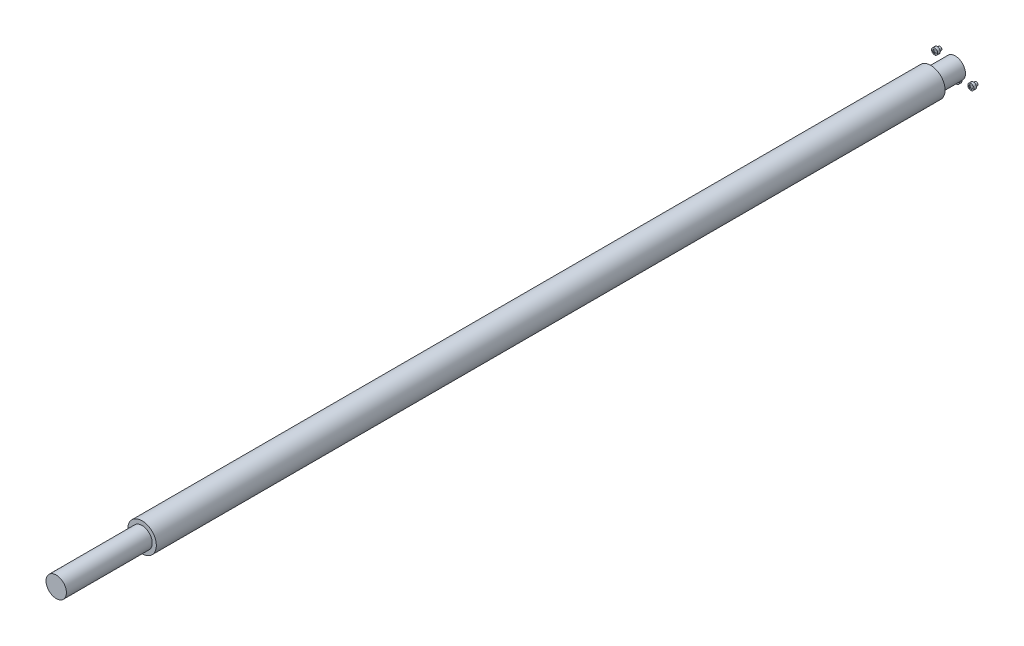
ISO-10303-21;
HEADER;
FILE_DESCRIPTION(('STEP AP214'),'2;1');
FILE_NAME('part.step','',(''),(''),'','','');
FILE_SCHEMA(('AUTOMOTIVE_DESIGN { 1 0 10303 214 1 1 1 1 }'));
ENDSEC;
DATA;
#1=APPLICATION_CONTEXT('core data for automotive mechanical design processes');
#2=APPLICATION_PROTOCOL_DEFINITION('international standard','automotive_design',2000,#1);
#3=PRODUCT_CONTEXT('',#1,'mechanical');
#4=PRODUCT('Part','Part','',(#3));
#5=PRODUCT_RELATED_PRODUCT_CATEGORY('part','',(#4));
#6=PRODUCT_DEFINITION_FORMATION('','',#4);
#7=PRODUCT_DEFINITION_CONTEXT('part definition',#1,'design');
#8=PRODUCT_DEFINITION('design','',#6,#7);
#9=PRODUCT_DEFINITION_SHAPE('','',#8);
#10=(LENGTH_UNIT() NAMED_UNIT(*) SI_UNIT(.MILLI.,.METRE.));
#11=(NAMED_UNIT(*) PLANE_ANGLE_UNIT() SI_UNIT($,.RADIAN.));
#12=(NAMED_UNIT(*) SI_UNIT($,.STERADIAN.) SOLID_ANGLE_UNIT());
#13=UNCERTAINTY_MEASURE_WITH_UNIT(LENGTH_MEASURE(1.E-05),#10,'distance_accuracy_value','');
#14=(GEOMETRIC_REPRESENTATION_CONTEXT(3) GLOBAL_UNCERTAINTY_ASSIGNED_CONTEXT((#13)) GLOBAL_UNIT_ASSIGNED_CONTEXT((#10,
#11,#12)) REPRESENTATION_CONTEXT('',''));
#15=CARTESIAN_POINT('',(0.,0.,0.));
#16=DIRECTION('',(0.,0.,1.));
#17=DIRECTION('',(1.,0.,0.));
#18=AXIS2_PLACEMENT_3D('',#15,#16,#17);
#19=CARTESIAN_POINT('',(582.682782954776,1105.19471758166,970.659545106125));
#20=DIRECTION('',(0.,0.,1.));
#21=DIRECTION('',(0.944379552147023,-0.328857509396682,0.));
#22=AXIS2_PLACEMENT_3D('',#19,#20,#21);
#23=PLANE('',#22);
#24=CARTESIAN_POINT('',(582.682782954776,1105.19471758166,970.659545106125));
#25=DIRECTION('',(0.,0.,1.));
#26=DIRECTION('',(0.944379552147023,-0.328857509396682,0.));
#27=AXIS2_PLACEMENT_3D('',#24,#25,#26);
#28=CIRCLE('',#27,0.825);
#29=CARTESIAN_POINT('',(583.461896085297,1104.92341013641,970.659545106125));
#30=VERTEX_POINT('',#29);
#31=EDGE_CURVE('P0_E25',#30,#30,#28,.T.);
#32=ORIENTED_EDGE('',*,*,#31,.T.);
#33=EDGE_LOOP('',(#32));
#34=FACE_BOUND('',#33,.T.);
#35=ADVANCED_FACE('P0_F17',(#34),#23,.T.);
#36=CARTESIAN_POINT('',(582.682782954776,1105.19471758166,970.659545106125));
#37=DIRECTION('',(0.,0.,1.));
#38=DIRECTION('',(0.944379552147023,-0.328857509396682,0.));
#39=AXIS2_PLACEMENT_3D('',#36,#37,#38);
#40=CYLINDRICAL_SURFACE('',#39,0.875);
#41=CARTESIAN_POINT('',(582.682782954776,1105.19471758166,970.609545106125));
#42=DIRECTION('',(0.,0.,1.));
#43=DIRECTION('',(0.944379552147023,-0.328857509396682,0.));
#44=AXIS2_PLACEMENT_3D('',#41,#42,#43);
#45=CIRCLE('',#44,0.875);
#46=CARTESIAN_POINT('',(583.509115062905,1104.90696726094,970.609545106125));
#47=VERTEX_POINT('',#46);
#48=EDGE_CURVE('P0_E11',#47,#47,#45,.F.);
#49=ORIENTED_EDGE('',*,*,#48,.T.);
#50=EDGE_LOOP('',(#49));
#51=FACE_BOUND('',#50,.T.);
#52=CARTESIAN_POINT('',(582.682782954776,1105.19471758166,969.219545106125));
#53=DIRECTION('',(0.,0.,1.));
#54=DIRECTION('',(0.944379552147023,-0.328857509396682,0.));
#55=AXIS2_PLACEMENT_3D('',#52,#53,#54);
#56=CIRCLE('',#55,0.875);
#57=CARTESIAN_POINT('',(583.509115062905,1104.90696726094,969.219545106125));
#58=VERTEX_POINT('',#57);
#59=EDGE_CURVE('P0_E130',#58,#58,#56,.T.);
#60=ORIENTED_EDGE('',*,*,#59,.T.);
#61=EDGE_LOOP('',(#60));
#62=FACE_BOUND('',#61,.T.);
#63=ADVANCED_FACE('P0_F146',(#51,#62),#40,.T.);
#64=CARTESIAN_POINT('',(582.970533275498,1106.02104968979,969.219545106125));
#65=DIRECTION('',(0.,0.,1.));
#66=DIRECTION('',(0.944379552147023,-0.328857509396682,0.));
#67=AXIS2_PLACEMENT_3D('',#64,#65,#66);
#68=PLANE('',#67);
#69=CARTESIAN_POINT('',(582.682782954776,1105.19471758166,969.219545106125));
#70=DIRECTION('',(0.,0.,1.));
#71=DIRECTION('',(0.944379552147023,-0.328857509396682,0.));
#72=AXIS2_PLACEMENT_3D('',#69,#70,#71);
#73=CIRCLE('',#72,1.5);
#74=CARTESIAN_POINT('',(584.099352282997,1104.70143131756,969.219545106125));
#75=VERTEX_POINT('',#74);
#76=EDGE_CURVE('P0_E127',#75,#75,#73,.T.);
#77=ORIENTED_EDGE('',*,*,#76,.T.);
#78=EDGE_LOOP('',(#77));
#79=FACE_BOUND('',#78,.T.);
#80=ORIENTED_EDGE('',*,*,#59,.F.);
#81=EDGE_LOOP('',(#80));
#82=FACE_BOUND('',#81,.T.);
#83=ADVANCED_FACE('P0_F150',(#79,#82),#68,.T.);
#84=CARTESIAN_POINT('',(582.682782954776,1105.19471758166,970.659545106125));
#85=DIRECTION('',(0.,0.,1.));
#86=DIRECTION('',(0.944379552147023,-0.328857509396682,0.));
#87=AXIS2_PLACEMENT_3D('',#84,#85,#86);
#88=CYLINDRICAL_SURFACE('',#87,1.5);
#89=CARTESIAN_POINT('',(582.682782954776,1105.19471758166,967.969545106125));
#90=DIRECTION('',(0.,0.,1.));
#91=DIRECTION('',(0.944379552147023,-0.328857509396682,0.));
#92=AXIS2_PLACEMENT_3D('',#89,#90,#91);
#93=CIRCLE('',#92,1.5);
#94=CARTESIAN_POINT('',(584.099352282997,1104.70143131756,967.969545106125));
#95=VERTEX_POINT('',#94);
#96=EDGE_CURVE('P0_E119',#95,#95,#93,.T.);
#97=ORIENTED_EDGE('',*,*,#96,.T.);
#98=EDGE_LOOP('',(#97));
#99=FACE_BOUND('',#98,.T.);
#100=ORIENTED_EDGE('',*,*,#76,.F.);
#101=EDGE_LOOP('',(#100));
#102=FACE_BOUND('',#101,.T.);
#103=ADVANCED_FACE('P0_F156',(#99,#102),#88,.T.);
#104=CARTESIAN_POINT('',(583.176069218871,1106.61128690988,967.969545106125));
#105=DIRECTION('',(0.,0.,-1.));
#106=DIRECTION('',(-0.944379552147023,0.328857509396682,0.));
#107=AXIS2_PLACEMENT_3D('',#104,#105,#106);
#108=PLANE('',#107);
#109=DIRECTION('',(0.187390818710705,-0.982285437672234,0.));
#110=VECTOR('',#109,1.);
#111=CARTESIAN_POINT('',(583.447616340566,1105.85491696466,967.969545106125));
#112=LINE('',#111,#110);
#113=CARTESIAN_POINT('',(583.447616340566,1105.85491696466,967.969545106125));
#114=VERTEX_POINT('',#113);
#115=CARTESIAN_POINT('',(583.636949084912,1104.8624521314,967.969545106125));
#116=VERTEX_POINT('',#115);
#117=EDGE_CURVE('P0_E32',#114,#116,#112,.T.);
#118=ORIENTED_EDGE('',*,*,#117,.F.);
#119=DIRECTION('',(0.944379552147023,-0.328857509396682,0.));
#120=VECTOR('',#119,1.);
#121=CARTESIAN_POINT('',(582.49345021043,1106.18718241492,967.969545106125));
#122=LINE('',#121,#120);
#123=CARTESIAN_POINT('',(582.49345021043,1106.18718241492,967.969545106125));
#124=VERTEX_POINT('',#123);
#125=EDGE_CURVE('P0_E115',#124,#114,#122,.T.);
#126=ORIENTED_EDGE('',*,*,#125,.F.);
#127=DIRECTION('',(0.756988733436318,0.653427928275552,0.));
#128=VECTOR('',#127,1.);
#129=CARTESIAN_POINT('',(581.72861682464,1105.52698303192,967.969545106125));
#130=LINE('',#129,#128);
#131=CARTESIAN_POINT('',(581.72861682464,1105.52698303192,967.969545106125));
#132=VERTEX_POINT('',#131);
#133=EDGE_CURVE('P0_E113',#132,#124,#130,.T.);
#134=ORIENTED_EDGE('',*,*,#133,.F.);
#135=DIRECTION('',(-0.187390818710705,0.982285437672234,0.));
#136=VECTOR('',#135,1.);
#137=CARTESIAN_POINT('',(581.917949568986,1104.53451819866,967.969545106125));
#138=LINE('',#137,#136);
#139=CARTESIAN_POINT('',(581.917949568986,1104.53451819866,967.969545106125));
#140=VERTEX_POINT('',#139);
#141=EDGE_CURVE('P0_E80',#140,#132,#138,.T.);
#142=ORIENTED_EDGE('',*,*,#141,.F.);
#143=DIRECTION('',(-0.944379552147023,0.328857509396682,0.));
#144=VECTOR('',#143,1.);
#145=CARTESIAN_POINT('',(582.872115699122,1104.2022527484,967.969545106125));
#146=LINE('',#145,#144);
#147=CARTESIAN_POINT('',(582.872115699122,1104.2022527484,967.969545106125));
#148=VERTEX_POINT('',#147);
#149=EDGE_CURVE('P0_E109',#148,#140,#146,.T.);
#150=ORIENTED_EDGE('',*,*,#149,.F.);
#151=DIRECTION('',(-0.756988733436318,-0.653427928275552,0.));
#152=VECTOR('',#151,1.);
#153=CARTESIAN_POINT('',(583.636949084912,1104.8624521314,967.969545106125));
#154=LINE('',#153,#152);
#155=EDGE_CURVE('P0_E106',#116,#148,#154,.T.);
#156=ORIENTED_EDGE('',*,*,#155,.F.);
#157=EDGE_LOOP('',(#118,#126,#134,#142,#150,#156));
#158=FACE_BOUND('',#157,.T.);
#159=ORIENTED_EDGE('',*,*,#96,.F.);
#160=EDGE_LOOP('',(#159));
#161=FACE_BOUND('',#160,.T.);
#162=ADVANCED_FACE('P0_F160',(#158,#161),#108,.T.);
#163=CARTESIAN_POINT('',(583.447616340566,1105.85491696466,968.469545106125));
#164=DIRECTION('',(0.982285437672234,0.187390818710705,0.));
#165=DIRECTION('',(-0.187390818710705,0.982285437672234,0.));
#166=AXIS2_PLACEMENT_3D('',#163,#164,#165);
#167=PLANE('',#166);
#168=ORIENTED_EDGE('',*,*,#117,.T.);
#169=DIRECTION('',(0.,0.,-1.));
#170=VECTOR('',#169,1.);
#171=CARTESIAN_POINT('',(583.636949084912,1104.8624521314,968.469545106125));
#172=LINE('',#171,#170);
#173=CARTESIAN_POINT('',(583.636949084912,1104.8624521314,968.469545106125));
#174=VERTEX_POINT('',#173);
#175=EDGE_CURVE('P0_E62',#174,#116,#172,.T.);
#176=ORIENTED_EDGE('',*,*,#175,.F.);
#177=DIRECTION('',(0.187390818710705,-0.982285437672234,0.));
#178=VECTOR('',#177,1.);
#179=CARTESIAN_POINT('',(583.447616340566,1105.85491696466,968.469545106125));
#180=LINE('',#179,#178);
#181=CARTESIAN_POINT('',(583.447616340566,1105.85491696466,968.469545106125));
#182=VERTEX_POINT('',#181);
#183=EDGE_CURVE('P0_E117',#182,#174,#180,.T.);
#184=ORIENTED_EDGE('',*,*,#183,.F.);
#185=DIRECTION('',(0.,0.,-1.));
#186=VECTOR('',#185,1.);
#187=CARTESIAN_POINT('',(583.447616340566,1105.85491696466,968.469545106125));
#188=LINE('',#187,#186);
#189=EDGE_CURVE('P0_E40',#182,#114,#188,.T.);
#190=ORIENTED_EDGE('',*,*,#189,.T.);
#191=EDGE_LOOP('',(#168,#176,#184,#190));
#192=FACE_BOUND('',#191,.T.);
#193=ADVANCED_FACE('P0_F164',(#192),#167,.F.);
#194=CARTESIAN_POINT('',(582.49345021043,1106.18718241492,968.469545106125));
#195=DIRECTION('',(0.328857509396682,0.944379552147023,0.));
#196=DIRECTION('',(-0.944379552147023,0.328857509396682,0.));
#197=AXIS2_PLACEMENT_3D('',#194,#195,#196);
#198=PLANE('',#197);
#199=ORIENTED_EDGE('',*,*,#125,.T.);
#200=ORIENTED_EDGE('',*,*,#189,.F.);
#201=DIRECTION('',(0.944379552147023,-0.328857509396682,0.));
#202=VECTOR('',#201,1.);
#203=CARTESIAN_POINT('',(582.49345021043,1106.18718241492,968.469545106125));
#204=LINE('',#203,#202);
#205=CARTESIAN_POINT('',(582.49345021043,1106.18718241492,968.469545106125));
#206=VERTEX_POINT('',#205);
#207=EDGE_CURVE('P0_E92',#206,#182,#204,.T.);
#208=ORIENTED_EDGE('',*,*,#207,.F.);
#209=DIRECTION('',(0.,0.,-1.));
#210=VECTOR('',#209,1.);
#211=CARTESIAN_POINT('',(582.49345021043,1106.18718241492,968.469545106125));
#212=LINE('',#211,#210);
#213=EDGE_CURVE('P0_E84',#206,#124,#212,.T.);
#214=ORIENTED_EDGE('',*,*,#213,.T.);
#215=EDGE_LOOP('',(#199,#200,#208,#214));
#216=FACE_BOUND('',#215,.T.);
#217=ADVANCED_FACE('P0_F168',(#216),#198,.F.);
#218=CARTESIAN_POINT('',(581.72861682464,1105.52698303192,968.469545106125));
#219=DIRECTION('',(-0.653427928275552,0.756988733436318,0.));
#220=DIRECTION('',(-0.756988733436318,-0.653427928275552,0.));
#221=AXIS2_PLACEMENT_3D('',#218,#219,#220);
#222=PLANE('',#221);
#223=ORIENTED_EDGE('',*,*,#133,.T.);
#224=ORIENTED_EDGE('',*,*,#213,.F.);
#225=DIRECTION('',(0.756988733436318,0.653427928275552,0.));
#226=VECTOR('',#225,1.);
#227=CARTESIAN_POINT('',(581.72861682464,1105.52698303192,968.469545106125));
#228=LINE('',#227,#226);
#229=CARTESIAN_POINT('',(581.72861682464,1105.52698303192,968.469545106125));
#230=VERTEX_POINT('',#229);
#231=EDGE_CURVE('P0_E88',#230,#206,#228,.T.);
#232=ORIENTED_EDGE('',*,*,#231,.F.);
#233=DIRECTION('',(0.,0.,-1.));
#234=VECTOR('',#233,1.);
#235=CARTESIAN_POINT('',(581.72861682464,1105.52698303192,968.469545106125));
#236=LINE('',#235,#234);
#237=EDGE_CURVE('P0_E73',#230,#132,#236,.T.);
#238=ORIENTED_EDGE('',*,*,#237,.T.);
#239=EDGE_LOOP('',(#223,#224,#232,#238));
#240=FACE_BOUND('',#239,.T.);
#241=ADVANCED_FACE('P0_F89',(#240),#222,.F.);
#242=CARTESIAN_POINT('',(581.917949568986,1104.53451819866,968.469545106125));
#243=DIRECTION('',(-0.982285437672234,-0.187390818710705,0.));
#244=DIRECTION('',(0.187390818710705,-0.982285437672234,0.));
#245=AXIS2_PLACEMENT_3D('',#242,#243,#244);
#246=PLANE('',#245);
#247=ORIENTED_EDGE('',*,*,#141,.T.);
#248=ORIENTED_EDGE('',*,*,#237,.F.);
#249=DIRECTION('',(-0.187390818710705,0.982285437672234,0.));
#250=VECTOR('',#249,1.);
#251=CARTESIAN_POINT('',(581.917949568986,1104.53451819866,968.469545106125));
#252=LINE('',#251,#250);
#253=CARTESIAN_POINT('',(581.917949568986,1104.53451819866,968.469545106125));
#254=VERTEX_POINT('',#253);
#255=EDGE_CURVE('P0_E77',#254,#230,#252,.T.);
#256=ORIENTED_EDGE('',*,*,#255,.F.);
#257=DIRECTION('',(0.,0.,-1.));
#258=VECTOR('',#257,1.);
#259=CARTESIAN_POINT('',(581.917949568986,1104.53451819866,968.469545106125));
#260=LINE('',#259,#258);
#261=EDGE_CURVE('P0_E85',#254,#140,#260,.T.);
#262=ORIENTED_EDGE('',*,*,#261,.T.);
#263=EDGE_LOOP('',(#247,#248,#256,#262));
#264=FACE_BOUND('',#263,.T.);
#265=ADVANCED_FACE('P0_F75',(#264),#246,.F.);
#266=CARTESIAN_POINT('',(582.872115699122,1104.2022527484,968.469545106125));
#267=DIRECTION('',(-0.328857509396682,-0.944379552147023,0.));
#268=DIRECTION('',(0.944379552147023,-0.328857509396682,0.));
#269=AXIS2_PLACEMENT_3D('',#266,#267,#268);
#270=PLANE('',#269);
#271=ORIENTED_EDGE('',*,*,#149,.T.);
#272=ORIENTED_EDGE('',*,*,#261,.F.);
#273=DIRECTION('',(-0.944379552147023,0.328857509396682,0.));
#274=VECTOR('',#273,1.);
#275=CARTESIAN_POINT('',(582.872115699122,1104.2022527484,968.469545106125));
#276=LINE('',#275,#274);
#277=CARTESIAN_POINT('',(582.872115699122,1104.2022527484,968.469545106125));
#278=VERTEX_POINT('',#277);
#279=EDGE_CURVE('P0_E98',#278,#254,#276,.T.);
#280=ORIENTED_EDGE('',*,*,#279,.F.);
#281=DIRECTION('',(0.,0.,-1.));
#282=VECTOR('',#281,1.);
#283=CARTESIAN_POINT('',(582.872115699122,1104.2022527484,968.469545106125));
#284=LINE('',#283,#282);
#285=EDGE_CURVE('P0_E122',#278,#148,#284,.T.);
#286=ORIENTED_EDGE('',*,*,#285,.T.);
#287=EDGE_LOOP('',(#271,#272,#280,#286));
#288=FACE_BOUND('',#287,.T.);
#289=ADVANCED_FACE('P0_F171',(#288),#270,.F.);
#290=CARTESIAN_POINT('',(583.636949084912,1104.8624521314,968.469545106125));
#291=DIRECTION('',(0.653427928275552,-0.756988733436318,0.));
#292=DIRECTION('',(0.756988733436318,0.653427928275552,0.));
#293=AXIS2_PLACEMENT_3D('',#290,#291,#292);
#294=PLANE('',#293);
#295=ORIENTED_EDGE('',*,*,#155,.T.);
#296=ORIENTED_EDGE('',*,*,#285,.F.);
#297=DIRECTION('',(-0.756988733436318,-0.653427928275552,0.));
#298=VECTOR('',#297,1.);
#299=CARTESIAN_POINT('',(583.636949084912,1104.8624521314,968.469545106125));
#300=LINE('',#299,#298);
#301=EDGE_CURVE('P0_E100',#174,#278,#300,.T.);
#302=ORIENTED_EDGE('',*,*,#301,.F.);
#303=ORIENTED_EDGE('',*,*,#175,.T.);
#304=EDGE_LOOP('',(#295,#296,#302,#303));
#305=FACE_BOUND('',#304,.T.);
#306=ADVANCED_FACE('P0_F142',(#305),#294,.F.);
#307=CARTESIAN_POINT('',(582.682782954776,1105.19471758166,968.469545106125));
#308=DIRECTION('',(0.,0.,-1.));
#309=DIRECTION('',(-0.944379552147023,0.328857509396682,0.));
#310=AXIS2_PLACEMENT_3D('',#307,#308,#309);
#311=PLANE('',#310);
#312=ORIENTED_EDGE('',*,*,#183,.T.);
#313=ORIENTED_EDGE('',*,*,#301,.T.);
#314=ORIENTED_EDGE('',*,*,#279,.T.);
#315=ORIENTED_EDGE('',*,*,#255,.T.);
#316=ORIENTED_EDGE('',*,*,#231,.T.);
#317=ORIENTED_EDGE('',*,*,#207,.T.);
#318=EDGE_LOOP('',(#312,#313,#314,#315,#316,#317));
#319=FACE_BOUND('',#318,.T.);
#320=ADVANCED_FACE('P0_F95',(#319),#311,.T.);
#321=CARTESIAN_POINT('',(582.682782954776,1105.19471758166,970.659545106125));
#322=DIRECTION('',(0.,0.,-1.));
#323=DIRECTION('',(-0.944379552147023,0.328857509396682,0.));
#324=AXIS2_PLACEMENT_3D('',#321,#322,#323);
#325=CONICAL_SURFACE('',#324,0.825,0.785398163397441);
#326=ORIENTED_EDGE('',*,*,#48,.F.);
#327=EDGE_LOOP('',(#326));
#328=FACE_BOUND('',#327,.T.);
#329=ORIENTED_EDGE('',*,*,#31,.F.);
#330=EDGE_LOOP('',(#329));
#331=FACE_BOUND('',#330,.T.);
#332=ADVANCED_FACE('P0_F19',(#328,#331),#325,.T.);
#333=CLOSED_SHELL('',(#35,#63,#83,#103,#162,#193,#217,#241,#265,#289,#306,#320,#332));
#334=MANIFOLD_SOLID_BREP('P0_B1',#333);
#335=CARTESIAN_POINT('',(594.619380406748,1110.96523673244,971.379545106124));
#336=DIRECTION('',(0.,0.,-1.));
#337=DIRECTION('',(0.429136435825367,-0.903239679956046,0.));
#338=AXIS2_PLACEMENT_3D('',#335,#336,#337);
#339=PLANE('',#338);
#340=CARTESIAN_POINT('',(594.619380406748,1110.96523673244,971.379545106124));
#341=DIRECTION('',(0.,0.,-1.));
#342=DIRECTION('',(0.429136435825367,-0.903239679956046,0.));
#343=AXIS2_PLACEMENT_3D('',#340,#341,#342);
#344=CIRCLE('',#343,0.825);
#345=CARTESIAN_POINT('',(594.973417966304,1110.22006399648,971.379545106124));
#346=VERTEX_POINT('',#345);
#347=EDGE_CURVE('P1_E25',#346,#346,#344,.T.);
#348=ORIENTED_EDGE('',*,*,#347,.T.);
#349=EDGE_LOOP('',(#348));
#350=FACE_BOUND('',#349,.T.);
#351=ADVANCED_FACE('P1_F17',(#350),#339,.T.);
#352=CARTESIAN_POINT('',(594.619380406748,1110.96523673244,971.379545106124));
#353=DIRECTION('',(0.,0.,-1.));
#354=DIRECTION('',(0.429136435825367,-0.903239679956046,0.));
#355=AXIS2_PLACEMENT_3D('',#352,#353,#354);
#356=CYLINDRICAL_SURFACE('',#355,0.875);
#357=CARTESIAN_POINT('',(594.619380406748,1110.96523673244,971.429545106124));
#358=DIRECTION('',(0.,0.,-1.));
#359=DIRECTION('',(0.429136435825367,-0.903239679956046,0.));
#360=AXIS2_PLACEMENT_3D('',#357,#358,#359);
#361=CIRCLE('',#360,0.875);
#362=CARTESIAN_POINT('',(594.994874788096,1110.17490201248,971.429545106124));
#363=VERTEX_POINT('',#362);
#364=EDGE_CURVE('P1_E11',#363,#363,#361,.F.);
#365=ORIENTED_EDGE('',*,*,#364,.T.);
#366=EDGE_LOOP('',(#365));
#367=FACE_BOUND('',#366,.T.);
#368=CARTESIAN_POINT('',(594.619380406748,1110.96523673244,972.819545106124));
#369=DIRECTION('',(0.,0.,-1.));
#370=DIRECTION('',(0.429136435825367,-0.903239679956046,0.));
#371=AXIS2_PLACEMENT_3D('',#368,#369,#370);
#372=CIRCLE('',#371,0.875);
#373=CARTESIAN_POINT('',(594.994874788096,1110.17490201248,972.819545106124));
#374=VERTEX_POINT('',#373);
#375=EDGE_CURVE('P1_E130',#374,#374,#372,.T.);
#376=ORIENTED_EDGE('',*,*,#375,.T.);
#377=EDGE_LOOP('',(#376));
#378=FACE_BOUND('',#377,.T.);
#379=ADVANCED_FACE('P1_F146',(#367,#378),#356,.T.);
#380=CARTESIAN_POINT('',(593.829045686787,1110.5897423511,972.819545106124));
#381=DIRECTION('',(0.,0.,-1.));
#382=DIRECTION('',(0.429136435825367,-0.903239679956046,0.));
#383=AXIS2_PLACEMENT_3D('',#380,#381,#382);
#384=PLANE('',#383);
#385=CARTESIAN_POINT('',(594.619380406748,1110.96523673244,972.819545106124));
#386=DIRECTION('',(0.,0.,-1.));
#387=DIRECTION('',(0.429136435825367,-0.903239679956046,0.));
#388=AXIS2_PLACEMENT_3D('',#385,#386,#387);
#389=CIRCLE('',#388,1.5);
#390=CARTESIAN_POINT('',(595.263085060486,1109.61037721251,972.819545106124));
#391=VERTEX_POINT('',#390);
#392=EDGE_CURVE('P1_E127',#391,#391,#389,.T.);
#393=ORIENTED_EDGE('',*,*,#392,.T.);
#394=EDGE_LOOP('',(#393));
#395=FACE_BOUND('',#394,.T.);
#396=ORIENTED_EDGE('',*,*,#375,.F.);
#397=EDGE_LOOP('',(#396));
#398=FACE_BOUND('',#397,.T.);
#399=ADVANCED_FACE('P1_F150',(#395,#398),#384,.T.);
#400=CARTESIAN_POINT('',(594.619380406748,1110.96523673244,971.379545106124));
#401=DIRECTION('',(0.,0.,-1.));
#402=DIRECTION('',(0.429136435825367,-0.903239679956046,0.));
#403=AXIS2_PLACEMENT_3D('',#400,#401,#402);
#404=CYLINDRICAL_SURFACE('',#403,1.5);
#405=CARTESIAN_POINT('',(594.619380406748,1110.96523673244,974.069545106124));
#406=DIRECTION('',(0.,0.,-1.));
#407=DIRECTION('',(0.429136435825367,-0.903239679956046,0.));
#408=AXIS2_PLACEMENT_3D('',#405,#406,#407);
#409=CIRCLE('',#408,1.5);
#410=CARTESIAN_POINT('',(595.263085060486,1109.61037721251,974.069545106124));
#411=VERTEX_POINT('',#410);
#412=EDGE_CURVE('P1_E119',#411,#411,#409,.T.);
#413=ORIENTED_EDGE('',*,*,#412,.T.);
#414=EDGE_LOOP('',(#413));
#415=FACE_BOUND('',#414,.T.);
#416=ORIENTED_EDGE('',*,*,#392,.F.);
#417=EDGE_LOOP('',(#416));
#418=FACE_BOUND('',#417,.T.);
#419=ADVANCED_FACE('P1_F156',(#415,#418),#404,.T.);
#420=CARTESIAN_POINT('',(593.264520886814,1110.32153207871,974.069545106124));
#421=DIRECTION('',(0.,0.,1.));
#422=DIRECTION('',(-0.429136435825367,0.903239679956046,0.));
#423=AXIS2_PLACEMENT_3D('',#420,#421,#422);
#424=PLANE('',#423);
#425=DIRECTION('',(0.996796726460746,-0.0799767848637452,0.));
#426=VECTOR('',#425,1.);
#427=CARTESIAN_POINT('',(594.045837468937,1110.13344238778,974.069545106124));
#428=LINE('',#427,#426);
#429=CARTESIAN_POINT('',(594.045837468937,1110.13344238778,974.069545106124));
#430=VERTEX_POINT('',#429);
#431=CARTESIAN_POINT('',(595.052963971048,1110.0526368058,974.069545106124));
#432=VERTEX_POINT('',#431);
#433=EDGE_CURVE('P1_E32',#430,#432,#428,.T.);
#434=ORIENTED_EDGE('',*,*,#433,.F.);
#435=DIRECTION('',(0.429136435825367,-0.903239679956046,0.));
#436=VECTOR('',#435,1.);
#437=CARTESIAN_POINT('',(593.612253904637,1111.04604231442,974.069545106124));
#438=LINE('',#437,#436);
#439=CARTESIAN_POINT('',(593.612253904637,1111.04604231442,974.069545106124));
#440=VERTEX_POINT('',#439);
#441=EDGE_CURVE('P1_E115',#440,#430,#438,.T.);
#442=ORIENTED_EDGE('',*,*,#441,.F.);
#443=DIRECTION('',(-0.567660290635379,-0.823262895092301,0.));
#444=VECTOR('',#443,1.);
#445=CARTESIAN_POINT('',(594.185796842448,1111.87783665908,974.069545106124));
#446=LINE('',#445,#444);
#447=CARTESIAN_POINT('',(594.185796842448,1111.87783665908,974.069545106124));
#448=VERTEX_POINT('',#447);
#449=EDGE_CURVE('P1_E113',#448,#440,#446,.T.);
#450=ORIENTED_EDGE('',*,*,#449,.F.);
#451=DIRECTION('',(-0.996796726460745,0.0799767848637449,0.));
#452=VECTOR('',#451,1.);
#453=CARTESIAN_POINT('',(595.19292334456,1111.79703107711,974.069545106124));
#454=LINE('',#453,#452);
#455=CARTESIAN_POINT('',(595.19292334456,1111.79703107711,974.069545106124));
#456=VERTEX_POINT('',#455);
#457=EDGE_CURVE('P1_E80',#456,#448,#454,.T.);
#458=ORIENTED_EDGE('',*,*,#457,.F.);
#459=DIRECTION('',(-0.429136435825367,0.903239679956046,0.));
#460=VECTOR('',#459,1.);
#461=CARTESIAN_POINT('',(595.62650690886,1110.88443115047,974.069545106124));
#462=LINE('',#461,#460);
#463=CARTESIAN_POINT('',(595.62650690886,1110.88443115047,974.069545106124));
#464=VERTEX_POINT('',#463);
#465=EDGE_CURVE('P1_E109',#464,#456,#462,.T.);
#466=ORIENTED_EDGE('',*,*,#465,.F.);
#467=DIRECTION('',(0.567660290635379,0.823262895092301,0.));
#468=VECTOR('',#467,1.);
#469=CARTESIAN_POINT('',(595.052963971048,1110.0526368058,974.069545106124));
#470=LINE('',#469,#468);
#471=EDGE_CURVE('P1_E106',#432,#464,#470,.T.);
#472=ORIENTED_EDGE('',*,*,#471,.F.);
#473=EDGE_LOOP('',(#434,#442,#450,#458,#466,#472));
#474=FACE_BOUND('',#473,.T.);
#475=ORIENTED_EDGE('',*,*,#412,.F.);
#476=EDGE_LOOP('',(#475));
#477=FACE_BOUND('',#476,.T.);
#478=ADVANCED_FACE('P1_F160',(#474,#477),#424,.T.);
#479=CARTESIAN_POINT('',(594.045837468937,1110.13344238778,973.569545106124));
#480=DIRECTION('',(-0.0799767848637451,-0.996796726460745,0.));
#481=DIRECTION('',(-0.996796726460746,0.0799767848637452,0.));
#482=AXIS2_PLACEMENT_3D('',#479,#480,#481);
#483=PLANE('',#482);
#484=ORIENTED_EDGE('',*,*,#433,.T.);
#485=DIRECTION('',(0.,0.,1.));
#486=VECTOR('',#485,1.);
#487=CARTESIAN_POINT('',(595.052963971048,1110.0526368058,973.569545106124));
#488=LINE('',#487,#486);
#489=CARTESIAN_POINT('',(595.052963971048,1110.0526368058,973.569545106124));
#490=VERTEX_POINT('',#489);
#491=EDGE_CURVE('P1_E62',#490,#432,#488,.T.);
#492=ORIENTED_EDGE('',*,*,#491,.F.);
#493=DIRECTION('',(0.996796726460746,-0.0799767848637452,0.));
#494=VECTOR('',#493,1.);
#495=CARTESIAN_POINT('',(594.045837468937,1110.13344238778,973.569545106124));
#496=LINE('',#495,#494);
#497=CARTESIAN_POINT('',(594.045837468937,1110.13344238778,973.569545106124));
#498=VERTEX_POINT('',#497);
#499=EDGE_CURVE('P1_E117',#498,#490,#496,.T.);
#500=ORIENTED_EDGE('',*,*,#499,.F.);
#501=DIRECTION('',(0.,0.,1.));
#502=VECTOR('',#501,1.);
#503=CARTESIAN_POINT('',(594.045837468937,1110.13344238778,973.569545106124));
#504=LINE('',#503,#502);
#505=EDGE_CURVE('P1_E40',#498,#430,#504,.T.);
#506=ORIENTED_EDGE('',*,*,#505,.T.);
#507=EDGE_LOOP('',(#484,#492,#500,#506));
#508=FACE_BOUND('',#507,.T.);
#509=ADVANCED_FACE('P1_F164',(#508),#483,.F.);
#510=CARTESIAN_POINT('',(593.612253904637,1111.04604231442,973.569545106124));
#511=DIRECTION('',(-0.903239679956046,-0.429136435825367,0.));
#512=DIRECTION('',(-0.429136435825367,0.903239679956046,0.));
#513=AXIS2_PLACEMENT_3D('',#510,#511,#512);
#514=PLANE('',#513);
#515=ORIENTED_EDGE('',*,*,#441,.T.);
#516=ORIENTED_EDGE('',*,*,#505,.F.);
#517=DIRECTION('',(0.429136435825367,-0.903239679956046,0.));
#518=VECTOR('',#517,1.);
#519=CARTESIAN_POINT('',(593.612253904637,1111.04604231442,973.569545106124));
#520=LINE('',#519,#518);
#521=CARTESIAN_POINT('',(593.612253904637,1111.04604231442,973.569545106124));
#522=VERTEX_POINT('',#521);
#523=EDGE_CURVE('P1_E92',#522,#498,#520,.T.);
#524=ORIENTED_EDGE('',*,*,#523,.F.);
#525=DIRECTION('',(0.,0.,1.));
#526=VECTOR('',#525,1.);
#527=CARTESIAN_POINT('',(593.612253904637,1111.04604231442,973.569545106124));
#528=LINE('',#527,#526);
#529=EDGE_CURVE('P1_E84',#522,#440,#528,.T.);
#530=ORIENTED_EDGE('',*,*,#529,.T.);
#531=EDGE_LOOP('',(#515,#516,#524,#530));
#532=FACE_BOUND('',#531,.T.);
#533=ADVANCED_FACE('P1_F168',(#532),#514,.F.);
#534=CARTESIAN_POINT('',(594.185796842448,1111.87783665908,973.569545106124));
#535=DIRECTION('',(-0.823262895092301,0.567660290635379,0.));
#536=DIRECTION('',(0.567660290635379,0.823262895092301,0.));
#537=AXIS2_PLACEMENT_3D('',#534,#535,#536);
#538=PLANE('',#537);
#539=ORIENTED_EDGE('',*,*,#449,.T.);
#540=ORIENTED_EDGE('',*,*,#529,.F.);
#541=DIRECTION('',(-0.567660290635379,-0.823262895092301,0.));
#542=VECTOR('',#541,1.);
#543=CARTESIAN_POINT('',(594.185796842448,1111.87783665908,973.569545106124));
#544=LINE('',#543,#542);
#545=CARTESIAN_POINT('',(594.185796842448,1111.87783665908,973.569545106124));
#546=VERTEX_POINT('',#545);
#547=EDGE_CURVE('P1_E88',#546,#522,#544,.T.);
#548=ORIENTED_EDGE('',*,*,#547,.F.);
#549=DIRECTION('',(0.,0.,1.));
#550=VECTOR('',#549,1.);
#551=CARTESIAN_POINT('',(594.185796842448,1111.87783665908,973.569545106124));
#552=LINE('',#551,#550);
#553=EDGE_CURVE('P1_E73',#546,#448,#552,.T.);
#554=ORIENTED_EDGE('',*,*,#553,.T.);
#555=EDGE_LOOP('',(#539,#540,#548,#554));
#556=FACE_BOUND('',#555,.T.);
#557=ADVANCED_FACE('P1_F89',(#556),#538,.F.);
#558=CARTESIAN_POINT('',(595.19292334456,1111.79703107711,973.569545106124));
#559=DIRECTION('',(0.0799767848637448,0.996796726460745,0.));
#560=DIRECTION('',(0.996796726460745,-0.0799767848637448,0.));
#561=AXIS2_PLACEMENT_3D('',#558,#559,#560);
#562=PLANE('',#561);
#563=ORIENTED_EDGE('',*,*,#457,.T.);
#564=ORIENTED_EDGE('',*,*,#553,.F.);
#565=DIRECTION('',(-0.996796726460745,0.0799767848637449,0.));
#566=VECTOR('',#565,1.);
#567=CARTESIAN_POINT('',(595.19292334456,1111.79703107711,973.569545106124));
#568=LINE('',#567,#566);
#569=CARTESIAN_POINT('',(595.19292334456,1111.79703107711,973.569545106124));
#570=VERTEX_POINT('',#569);
#571=EDGE_CURVE('P1_E77',#570,#546,#568,.T.);
#572=ORIENTED_EDGE('',*,*,#571,.F.);
#573=DIRECTION('',(0.,0.,1.));
#574=VECTOR('',#573,1.);
#575=CARTESIAN_POINT('',(595.19292334456,1111.79703107711,973.569545106124));
#576=LINE('',#575,#574);
#577=EDGE_CURVE('P1_E85',#570,#456,#576,.T.);
#578=ORIENTED_EDGE('',*,*,#577,.T.);
#579=EDGE_LOOP('',(#563,#564,#572,#578));
#580=FACE_BOUND('',#579,.T.);
#581=ADVANCED_FACE('P1_F75',(#580),#562,.F.);
#582=CARTESIAN_POINT('',(595.62650690886,1110.88443115047,973.569545106124));
#583=DIRECTION('',(0.903239679956046,0.429136435825367,0.));
#584=DIRECTION('',(0.429136435825367,-0.903239679956046,0.));
#585=AXIS2_PLACEMENT_3D('',#582,#583,#584);
#586=PLANE('',#585);
#587=ORIENTED_EDGE('',*,*,#465,.T.);
#588=ORIENTED_EDGE('',*,*,#577,.F.);
#589=DIRECTION('',(-0.429136435825367,0.903239679956046,0.));
#590=VECTOR('',#589,1.);
#591=CARTESIAN_POINT('',(595.62650690886,1110.88443115047,973.569545106124));
#592=LINE('',#591,#590);
#593=CARTESIAN_POINT('',(595.62650690886,1110.88443115047,973.569545106124));
#594=VERTEX_POINT('',#593);
#595=EDGE_CURVE('P1_E98',#594,#570,#592,.T.);
#596=ORIENTED_EDGE('',*,*,#595,.F.);
#597=DIRECTION('',(0.,0.,1.));
#598=VECTOR('',#597,1.);
#599=CARTESIAN_POINT('',(595.62650690886,1110.88443115047,973.569545106124));
#600=LINE('',#599,#598);
#601=EDGE_CURVE('P1_E122',#594,#464,#600,.T.);
#602=ORIENTED_EDGE('',*,*,#601,.T.);
#603=EDGE_LOOP('',(#587,#588,#596,#602));
#604=FACE_BOUND('',#603,.T.);
#605=ADVANCED_FACE('P1_F171',(#604),#586,.F.);
#606=CARTESIAN_POINT('',(595.052963971048,1110.0526368058,973.569545106124));
#607=DIRECTION('',(0.823262895092301,-0.567660290635379,0.));
#608=DIRECTION('',(-0.567660290635379,-0.823262895092301,0.));
#609=AXIS2_PLACEMENT_3D('',#606,#607,#608);
#610=PLANE('',#609);
#611=ORIENTED_EDGE('',*,*,#471,.T.);
#612=ORIENTED_EDGE('',*,*,#601,.F.);
#613=DIRECTION('',(0.567660290635379,0.823262895092301,0.));
#614=VECTOR('',#613,1.);
#615=CARTESIAN_POINT('',(595.052963971048,1110.0526368058,973.569545106124));
#616=LINE('',#615,#614);
#617=EDGE_CURVE('P1_E100',#490,#594,#616,.T.);
#618=ORIENTED_EDGE('',*,*,#617,.F.);
#619=ORIENTED_EDGE('',*,*,#491,.T.);
#620=EDGE_LOOP('',(#611,#612,#618,#619));
#621=FACE_BOUND('',#620,.T.);
#622=ADVANCED_FACE('P1_F142',(#621),#610,.F.);
#623=CARTESIAN_POINT('',(594.619380406748,1110.96523673244,973.569545106124));
#624=DIRECTION('',(0.,0.,1.));
#625=DIRECTION('',(-0.429136435825367,0.903239679956046,0.));
#626=AXIS2_PLACEMENT_3D('',#623,#624,#625);
#627=PLANE('',#626);
#628=ORIENTED_EDGE('',*,*,#499,.T.);
#629=ORIENTED_EDGE('',*,*,#617,.T.);
#630=ORIENTED_EDGE('',*,*,#595,.T.);
#631=ORIENTED_EDGE('',*,*,#571,.T.);
#632=ORIENTED_EDGE('',*,*,#547,.T.);
#633=ORIENTED_EDGE('',*,*,#523,.T.);
#634=EDGE_LOOP('',(#628,#629,#630,#631,#632,#633));
#635=FACE_BOUND('',#634,.T.);
#636=ADVANCED_FACE('P1_F95',(#635),#627,.T.);
#637=CARTESIAN_POINT('',(594.619380406748,1110.96523673244,971.379545106124));
#638=DIRECTION('',(0.,0.,1.));
#639=DIRECTION('',(-0.429136435825367,0.903239679956046,0.));
#640=AXIS2_PLACEMENT_3D('',#637,#638,#639);
#641=CONICAL_SURFACE('',#640,0.825,0.785398163397441);
#642=ORIENTED_EDGE('',*,*,#364,.F.);
#643=EDGE_LOOP('',(#642));
#644=FACE_BOUND('',#643,.T.);
#645=ORIENTED_EDGE('',*,*,#347,.F.);
#646=EDGE_LOOP('',(#645));
#647=FACE_BOUND('',#646,.T.);
#648=ADVANCED_FACE('P1_F19',(#644,#647),#641,.T.);
#649=CLOSED_SHELL('',(#351,#379,#399,#419,#478,#509,#533,#557,#581,#605,#622,#636,#648));
#650=MANIFOLD_SOLID_BREP('P1_B1',#649);
#651=CARTESIAN_POINT('',(576.912263803992,1117.13131503363,971.379545106124));
#652=DIRECTION('',(0.,0.,-1.));
#653=DIRECTION('',(0.429136435825367,-0.903239679956046,0.));
#654=AXIS2_PLACEMENT_3D('',#651,#652,#653);
#655=PLANE('',#654);
#656=CARTESIAN_POINT('',(576.912263803992,1117.13131503363,971.379545106124));
#657=DIRECTION('',(0.,0.,-1.));
#658=DIRECTION('',(0.429136435825367,-0.903239679956046,0.));
#659=AXIS2_PLACEMENT_3D('',#656,#657,#658);
#660=CIRCLE('',#659,0.825);
#661=CARTESIAN_POINT('',(577.266301363548,1116.38614229767,971.379545106124));
#662=VERTEX_POINT('',#661);
#663=EDGE_CURVE('P2_E24',#662,#662,#660,.T.);
#664=ORIENTED_EDGE('',*,*,#663,.T.);
#665=EDGE_LOOP('',(#664));
#666=FACE_BOUND('',#665,.T.);
#667=ADVANCED_FACE('P2_F16',(#666),#655,.T.);
#668=CARTESIAN_POINT('',(576.912263803992,1117.13131503363,971.379545106124));
#669=DIRECTION('',(0.,0.,-1.));
#670=DIRECTION('',(0.429136435825367,-0.903239679956046,0.));
#671=AXIS2_PLACEMENT_3D('',#668,#669,#670);
#672=CYLINDRICAL_SURFACE('',#671,0.875);
#673=CARTESIAN_POINT('',(576.912263803992,1117.13131503363,971.429545106124));
#674=DIRECTION('',(0.,0.,-1.));
#675=DIRECTION('',(0.429136435825367,-0.903239679956046,0.));
#676=AXIS2_PLACEMENT_3D('',#673,#674,#675);
#677=CIRCLE('',#676,0.875);
#678=CARTESIAN_POINT('',(577.287758185339,1116.34098031367,971.429545106124));
#679=VERTEX_POINT('',#678);
#680=EDGE_CURVE('P2_E10',#679,#679,#677,.F.);
#681=ORIENTED_EDGE('',*,*,#680,.T.);
#682=EDGE_LOOP('',(#681));
#683=FACE_BOUND('',#682,.T.);
#684=CARTESIAN_POINT('',(576.912263803992,1117.13131503363,972.819545106124));
#685=DIRECTION('',(0.,0.,-1.));
#686=DIRECTION('',(0.429136435825367,-0.903239679956046,0.));
#687=AXIS2_PLACEMENT_3D('',#684,#685,#686);
#688=CIRCLE('',#687,0.875);
#689=CARTESIAN_POINT('',(577.287758185339,1116.34098031367,972.819545106124));
#690=VERTEX_POINT('',#689);
#691=EDGE_CURVE('P2_E129',#690,#690,#688,.T.);
#692=ORIENTED_EDGE('',*,*,#691,.T.);
#693=EDGE_LOOP('',(#692));
#694=FACE_BOUND('',#693,.T.);
#695=ADVANCED_FACE('P2_F145',(#683,#694),#672,.T.);
#696=CARTESIAN_POINT('',(576.12192908403,1116.75582065228,972.819545106124));
#697=DIRECTION('',(0.,0.,-1.));
#698=DIRECTION('',(0.429136435825367,-0.903239679956046,0.));
#699=AXIS2_PLACEMENT_3D('',#696,#697,#698);
#700=PLANE('',#699);
#701=CARTESIAN_POINT('',(576.912263803992,1117.13131503363,972.819545106124));
#702=DIRECTION('',(0.,0.,-1.));
#703=DIRECTION('',(0.429136435825367,-0.903239679956046,0.));
#704=AXIS2_PLACEMENT_3D('',#701,#702,#703);
#705=CIRCLE('',#704,1.5);
#706=CARTESIAN_POINT('',(577.55596845773,1115.7764555137,972.819545106124));
#707=VERTEX_POINT('',#706);
#708=EDGE_CURVE('P2_E126',#707,#707,#705,.T.);
#709=ORIENTED_EDGE('',*,*,#708,.T.);
#710=EDGE_LOOP('',(#709));
#711=FACE_BOUND('',#710,.T.);
#712=ORIENTED_EDGE('',*,*,#691,.F.);
#713=EDGE_LOOP('',(#712));
#714=FACE_BOUND('',#713,.T.);
#715=ADVANCED_FACE('P2_F149',(#711,#714),#700,.T.);
#716=CARTESIAN_POINT('',(576.912263803992,1117.13131503363,971.379545106124));
#717=DIRECTION('',(0.,0.,-1.));
#718=DIRECTION('',(0.429136435825367,-0.903239679956046,0.));
#719=AXIS2_PLACEMENT_3D('',#716,#717,#718);
#720=CYLINDRICAL_SURFACE('',#719,1.5);
#721=CARTESIAN_POINT('',(576.912263803992,1117.13131503363,974.069545106124));
#722=DIRECTION('',(0.,0.,-1.));
#723=DIRECTION('',(0.429136435825367,-0.903239679956046,0.));
#724=AXIS2_PLACEMENT_3D('',#721,#722,#723);
#725=CIRCLE('',#724,1.5);
#726=CARTESIAN_POINT('',(577.55596845773,1115.7764555137,974.069545106124));
#727=VERTEX_POINT('',#726);
#728=EDGE_CURVE('P2_E118',#727,#727,#725,.T.);
#729=ORIENTED_EDGE('',*,*,#728,.T.);
#730=EDGE_LOOP('',(#729));
#731=FACE_BOUND('',#730,.T.);
#732=ORIENTED_EDGE('',*,*,#708,.F.);
#733=EDGE_LOOP('',(#732));
#734=FACE_BOUND('',#733,.T.);
#735=ADVANCED_FACE('P2_F155',(#731,#734),#720,.T.);
#736=CARTESIAN_POINT('',(575.557404284057,1116.48761037989,974.069545106124));
#737=DIRECTION('',(0.,0.,1.));
#738=DIRECTION('',(-0.429136435825367,0.903239679956046,0.));
#739=AXIS2_PLACEMENT_3D('',#736,#737,#738);
#740=PLANE('',#739);
#741=DIRECTION('',(0.996796726460746,-0.0799767848637452,0.));
#742=VECTOR('',#741,1.);
#743=CARTESIAN_POINT('',(576.33872086618,1116.29952068896,974.069545106124));
#744=LINE('',#743,#742);
#745=CARTESIAN_POINT('',(576.33872086618,1116.29952068896,974.069545106124));
#746=VERTEX_POINT('',#745);
#747=CARTESIAN_POINT('',(577.345847368292,1116.21871510699,974.069545106124));
#748=VERTEX_POINT('',#747);
#749=EDGE_CURVE('P2_E31',#746,#748,#744,.T.);
#750=ORIENTED_EDGE('',*,*,#749,.F.);
#751=DIRECTION('',(0.429136435825367,-0.903239679956046,0.));
#752=VECTOR('',#751,1.);
#753=CARTESIAN_POINT('',(575.90513730188,1117.2121206156,974.069545106124));
#754=LINE('',#753,#752);
#755=CARTESIAN_POINT('',(575.90513730188,1117.2121206156,974.069545106124));
#756=VERTEX_POINT('',#755);
#757=EDGE_CURVE('P2_E114',#756,#746,#754,.T.);
#758=ORIENTED_EDGE('',*,*,#757,.F.);
#759=DIRECTION('',(-0.567660290635379,-0.823262895092301,0.));
#760=VECTOR('',#759,1.);
#761=CARTESIAN_POINT('',(576.478680239692,1118.04391496027,974.069545106124));
#762=LINE('',#761,#760);
#763=CARTESIAN_POINT('',(576.478680239692,1118.04391496027,974.069545106124));
#764=VERTEX_POINT('',#763);
#765=EDGE_CURVE('P2_E112',#764,#756,#762,.T.);
#766=ORIENTED_EDGE('',*,*,#765,.F.);
#767=DIRECTION('',(-0.996796726460745,0.0799767848637449,0.));
#768=VECTOR('',#767,1.);
#769=CARTESIAN_POINT('',(577.485806741803,1117.9631093783,974.069545106124));
#770=LINE('',#769,#768);
#771=CARTESIAN_POINT('',(577.485806741803,1117.9631093783,974.069545106124));
#772=VERTEX_POINT('',#771);
#773=EDGE_CURVE('P2_E79',#772,#764,#770,.T.);
#774=ORIENTED_EDGE('',*,*,#773,.F.);
#775=DIRECTION('',(-0.429136435825367,0.903239679956046,0.));
#776=VECTOR('',#775,1.);
#777=CARTESIAN_POINT('',(577.919390306103,1117.05050945166,974.069545106124));
#778=LINE('',#777,#776);
#779=CARTESIAN_POINT('',(577.919390306103,1117.05050945166,974.069545106124));
#780=VERTEX_POINT('',#779);
#781=EDGE_CURVE('P2_E108',#780,#772,#778,.T.);
#782=ORIENTED_EDGE('',*,*,#781,.F.);
#783=DIRECTION('',(0.567660290635379,0.823262895092301,0.));
#784=VECTOR('',#783,1.);
#785=CARTESIAN_POINT('',(577.345847368292,1116.21871510699,974.069545106124));
#786=LINE('',#785,#784);
#787=EDGE_CURVE('P2_E105',#748,#780,#786,.T.);
#788=ORIENTED_EDGE('',*,*,#787,.F.);
#789=EDGE_LOOP('',(#750,#758,#766,#774,#782,#788));
#790=FACE_BOUND('',#789,.T.);
#791=ORIENTED_EDGE('',*,*,#728,.F.);
#792=EDGE_LOOP('',(#791));
#793=FACE_BOUND('',#792,.T.);
#794=ADVANCED_FACE('P2_F159',(#790,#793),#740,.T.);
#795=CARTESIAN_POINT('',(576.33872086618,1116.29952068896,973.569545106124));
#796=DIRECTION('',(-0.0799767848637451,-0.996796726460745,0.));
#797=DIRECTION('',(-0.996796726460746,0.0799767848637452,0.));
#798=AXIS2_PLACEMENT_3D('',#795,#796,#797);
#799=PLANE('',#798);
#800=ORIENTED_EDGE('',*,*,#749,.T.);
#801=DIRECTION('',(0.,0.,1.));
#802=VECTOR('',#801,1.);
#803=CARTESIAN_POINT('',(577.345847368292,1116.21871510699,973.569545106124));
#804=LINE('',#803,#802);
#805=CARTESIAN_POINT('',(577.345847368292,1116.21871510699,973.569545106124));
#806=VERTEX_POINT('',#805);
#807=EDGE_CURVE('P2_E61',#806,#748,#804,.T.);
#808=ORIENTED_EDGE('',*,*,#807,.F.);
#809=DIRECTION('',(0.996796726460746,-0.0799767848637452,0.));
#810=VECTOR('',#809,1.);
#811=CARTESIAN_POINT('',(576.33872086618,1116.29952068896,973.569545106124));
#812=LINE('',#811,#810);
#813=CARTESIAN_POINT('',(576.33872086618,1116.29952068896,973.569545106124));
#814=VERTEX_POINT('',#813);
#815=EDGE_CURVE('P2_E116',#814,#806,#812,.T.);
#816=ORIENTED_EDGE('',*,*,#815,.F.);
#817=DIRECTION('',(0.,0.,1.));
#818=VECTOR('',#817,1.);
#819=CARTESIAN_POINT('',(576.33872086618,1116.29952068896,973.569545106124));
#820=LINE('',#819,#818);
#821=EDGE_CURVE('P2_E39',#814,#746,#820,.T.);
#822=ORIENTED_EDGE('',*,*,#821,.T.);
#823=EDGE_LOOP('',(#800,#808,#816,#822));
#824=FACE_BOUND('',#823,.T.);
#825=ADVANCED_FACE('P2_F163',(#824),#799,.F.);
#826=CARTESIAN_POINT('',(575.90513730188,1117.2121206156,973.569545106124));
#827=DIRECTION('',(-0.903239679956046,-0.429136435825367,0.));
#828=DIRECTION('',(-0.429136435825367,0.903239679956046,0.));
#829=AXIS2_PLACEMENT_3D('',#826,#827,#828);
#830=PLANE('',#829);
#831=ORIENTED_EDGE('',*,*,#757,.T.);
#832=ORIENTED_EDGE('',*,*,#821,.F.);
#833=DIRECTION('',(0.429136435825367,-0.903239679956046,0.));
#834=VECTOR('',#833,1.);
#835=CARTESIAN_POINT('',(575.90513730188,1117.2121206156,973.569545106124));
#836=LINE('',#835,#834);
#837=CARTESIAN_POINT('',(575.90513730188,1117.2121206156,973.569545106124));
#838=VERTEX_POINT('',#837);
#839=EDGE_CURVE('P2_E91',#838,#814,#836,.T.);
#840=ORIENTED_EDGE('',*,*,#839,.F.);
#841=DIRECTION('',(0.,0.,1.));
#842=VECTOR('',#841,1.);
#843=CARTESIAN_POINT('',(575.90513730188,1117.2121206156,973.569545106124));
#844=LINE('',#843,#842);
#845=EDGE_CURVE('P2_E83',#838,#756,#844,.T.);
#846=ORIENTED_EDGE('',*,*,#845,.T.);
#847=EDGE_LOOP('',(#831,#832,#840,#846));
#848=FACE_BOUND('',#847,.T.);
#849=ADVANCED_FACE('P2_F167',(#848),#830,.F.);
#850=CARTESIAN_POINT('',(576.478680239692,1118.04391496027,973.569545106124));
#851=DIRECTION('',(-0.823262895092301,0.567660290635379,0.));
#852=DIRECTION('',(0.567660290635379,0.823262895092301,0.));
#853=AXIS2_PLACEMENT_3D('',#850,#851,#852);
#854=PLANE('',#853);
#855=ORIENTED_EDGE('',*,*,#765,.T.);
#856=ORIENTED_EDGE('',*,*,#845,.F.);
#857=DIRECTION('',(-0.567660290635379,-0.823262895092301,0.));
#858=VECTOR('',#857,1.);
#859=CARTESIAN_POINT('',(576.478680239692,1118.04391496027,973.569545106124));
#860=LINE('',#859,#858);
#861=CARTESIAN_POINT('',(576.478680239692,1118.04391496027,973.569545106124));
#862=VERTEX_POINT('',#861);
#863=EDGE_CURVE('P2_E87',#862,#838,#860,.T.);
#864=ORIENTED_EDGE('',*,*,#863,.F.);
#865=DIRECTION('',(0.,0.,1.));
#866=VECTOR('',#865,1.);
#867=CARTESIAN_POINT('',(576.478680239692,1118.04391496027,973.569545106124));
#868=LINE('',#867,#866);
#869=EDGE_CURVE('P2_E72',#862,#764,#868,.T.);
#870=ORIENTED_EDGE('',*,*,#869,.T.);
#871=EDGE_LOOP('',(#855,#856,#864,#870));
#872=FACE_BOUND('',#871,.T.);
#873=ADVANCED_FACE('P2_F88',(#872),#854,.F.);
#874=CARTESIAN_POINT('',(577.485806741803,1117.9631093783,973.569545106124));
#875=DIRECTION('',(0.0799767848637448,0.996796726460745,0.));
#876=DIRECTION('',(0.996796726460745,-0.0799767848637448,0.));
#877=AXIS2_PLACEMENT_3D('',#874,#875,#876);
#878=PLANE('',#877);
#879=ORIENTED_EDGE('',*,*,#773,.T.);
#880=ORIENTED_EDGE('',*,*,#869,.F.);
#881=DIRECTION('',(-0.996796726460745,0.0799767848637449,0.));
#882=VECTOR('',#881,1.);
#883=CARTESIAN_POINT('',(577.485806741803,1117.9631093783,973.569545106124));
#884=LINE('',#883,#882);
#885=CARTESIAN_POINT('',(577.485806741803,1117.9631093783,973.569545106124));
#886=VERTEX_POINT('',#885);
#887=EDGE_CURVE('P2_E76',#886,#862,#884,.T.);
#888=ORIENTED_EDGE('',*,*,#887,.F.);
#889=DIRECTION('',(0.,0.,1.));
#890=VECTOR('',#889,1.);
#891=CARTESIAN_POINT('',(577.485806741803,1117.9631093783,973.569545106124));
#892=LINE('',#891,#890);
#893=EDGE_CURVE('P2_E84',#886,#772,#892,.T.);
#894=ORIENTED_EDGE('',*,*,#893,.T.);
#895=EDGE_LOOP('',(#879,#880,#888,#894));
#896=FACE_BOUND('',#895,.T.);
#897=ADVANCED_FACE('P2_F74',(#896),#878,.F.);
#898=CARTESIAN_POINT('',(577.919390306103,1117.05050945166,973.569545106124));
#899=DIRECTION('',(0.903239679956046,0.429136435825367,0.));
#900=DIRECTION('',(0.429136435825367,-0.903239679956046,0.));
#901=AXIS2_PLACEMENT_3D('',#898,#899,#900);
#902=PLANE('',#901);
#903=ORIENTED_EDGE('',*,*,#781,.T.);
#904=ORIENTED_EDGE('',*,*,#893,.F.);
#905=DIRECTION('',(-0.429136435825367,0.903239679956046,0.));
#906=VECTOR('',#905,1.);
#907=CARTESIAN_POINT('',(577.919390306103,1117.05050945166,973.569545106124));
#908=LINE('',#907,#906);
#909=CARTESIAN_POINT('',(577.919390306103,1117.05050945166,973.569545106124));
#910=VERTEX_POINT('',#909);
#911=EDGE_CURVE('P2_E97',#910,#886,#908,.T.);
#912=ORIENTED_EDGE('',*,*,#911,.F.);
#913=DIRECTION('',(0.,0.,1.));
#914=VECTOR('',#913,1.);
#915=CARTESIAN_POINT('',(577.919390306103,1117.05050945166,973.569545106124));
#916=LINE('',#915,#914);
#917=EDGE_CURVE('P2_E121',#910,#780,#916,.T.);
#918=ORIENTED_EDGE('',*,*,#917,.T.);
#919=EDGE_LOOP('',(#903,#904,#912,#918));
#920=FACE_BOUND('',#919,.T.);
#921=ADVANCED_FACE('P2_F170',(#920),#902,.F.);
#922=CARTESIAN_POINT('',(577.345847368292,1116.21871510699,973.569545106124));
#923=DIRECTION('',(0.823262895092301,-0.567660290635379,0.));
#924=DIRECTION('',(-0.567660290635379,-0.823262895092301,0.));
#925=AXIS2_PLACEMENT_3D('',#922,#923,#924);
#926=PLANE('',#925);
#927=ORIENTED_EDGE('',*,*,#787,.T.);
#928=ORIENTED_EDGE('',*,*,#917,.F.);
#929=DIRECTION('',(0.567660290635379,0.823262895092301,0.));
#930=VECTOR('',#929,1.);
#931=CARTESIAN_POINT('',(577.345847368292,1116.21871510699,973.569545106124));
#932=LINE('',#931,#930);
#933=EDGE_CURVE('P2_E99',#806,#910,#932,.T.);
#934=ORIENTED_EDGE('',*,*,#933,.F.);
#935=ORIENTED_EDGE('',*,*,#807,.T.);
#936=EDGE_LOOP('',(#927,#928,#934,#935));
#937=FACE_BOUND('',#936,.T.);
#938=ADVANCED_FACE('P2_F141',(#937),#926,.F.);
#939=CARTESIAN_POINT('',(576.912263803992,1117.13131503363,973.569545106124));
#940=DIRECTION('',(0.,0.,1.));
#941=DIRECTION('',(-0.429136435825367,0.903239679956046,0.));
#942=AXIS2_PLACEMENT_3D('',#939,#940,#941);
#943=PLANE('',#942);
#944=ORIENTED_EDGE('',*,*,#815,.T.);
#945=ORIENTED_EDGE('',*,*,#933,.T.);
#946=ORIENTED_EDGE('',*,*,#911,.T.);
#947=ORIENTED_EDGE('',*,*,#887,.T.);
#948=ORIENTED_EDGE('',*,*,#863,.T.);
#949=ORIENTED_EDGE('',*,*,#839,.T.);
#950=EDGE_LOOP('',(#944,#945,#946,#947,#948,#949));
#951=FACE_BOUND('',#950,.T.);
#952=ADVANCED_FACE('P2_F94',(#951),#943,.T.);
#953=CARTESIAN_POINT('',(576.912263803992,1117.13131503363,971.379545106124));
#954=DIRECTION('',(0.,0.,1.));
#955=DIRECTION('',(-0.429136435825367,0.903239679956046,0.));
#956=AXIS2_PLACEMENT_3D('',#953,#954,#955);
#957=CONICAL_SURFACE('',#956,0.825,0.785398163397441);
#958=ORIENTED_EDGE('',*,*,#680,.F.);
#959=EDGE_LOOP('',(#958));
#960=FACE_BOUND('',#959,.T.);
#961=ORIENTED_EDGE('',*,*,#663,.F.);
#962=EDGE_LOOP('',(#961));
#963=FACE_BOUND('',#962,.T.);
#964=ADVANCED_FACE('P2_F18',(#960,#963),#957,.T.);
#965=CLOSED_SHELL('',(#667,#695,#715,#735,#794,#825,#849,#873,#897,#921,#938,#952,#964));
#966=MANIFOLD_SOLID_BREP('P2_B1',#965);
#967=CARTESIAN_POINT('',(585.765822105588,1114.04827588294,1412.81954510612));
#968=DIRECTION('',(0.,0.,1.));
#969=DIRECTION('',(-0.582684782852807,0.812698248941006,0.));
#970=AXIS2_PLACEMENT_3D('',#967,#968,#969);
#971=PLANE('',#970);
#972=CARTESIAN_POINT('',(585.765822105588,1114.04827588294,1412.81954510612));
#973=DIRECTION('',(0.,0.,-1.));
#974=DIRECTION('',(0.582684782852807,-0.812698248941006,0.));
#975=AXIS2_PLACEMENT_3D('',#972,#973,#974);
#976=CIRCLE('',#975,5.);
#977=CARTESIAN_POINT('',(588.679246019852,1109.98478463824,1412.81954510612));
#978=VERTEX_POINT('',#977);
#979=EDGE_CURVE('P3_E37',#978,#978,#976,.T.);
#980=ORIENTED_EDGE('',*,*,#979,.F.);
#981=EDGE_LOOP('',(#980));
#982=FACE_BOUND('',#981,.T.);
#983=ADVANCED_FACE('P3_F15',(#982),#971,.T.);
#984=CARTESIAN_POINT('',(581.702330860883,1111.13485196866,972.819545106124));
#985=DIRECTION('',(0.,0.,-1.));
#986=DIRECTION('',(0.582684782852807,-0.812698248941006,0.));
#987=AXIS2_PLACEMENT_3D('',#984,#985,#986);
#988=PLANE('',#987);
#989=CARTESIAN_POINT('',(585.765822105588,1114.04827588292,972.819545106124));
#990=DIRECTION('',(0.,0.,-1.));
#991=DIRECTION('',(0.582684782852807,-0.812698248941006,0.));
#992=AXIS2_PLACEMENT_3D('',#989,#990,#991);
#993=CIRCLE('',#992,5.00000000000002);
#994=CARTESIAN_POINT('',(588.679246019852,1109.98478463822,972.819545106125));
#995=VERTEX_POINT('',#994);
#996=EDGE_CURVE('P3_E10',#995,#995,#993,.T.);
#997=ORIENTED_EDGE('',*,*,#996,.T.);
#998=EDGE_LOOP('',(#997));
#999=FACE_BOUND('',#998,.T.);
#1000=ADVANCED_FACE('P3_F45',(#999),#988,.T.);
#1001=CARTESIAN_POINT('',(585.765822105588,1114.04827588294,1412.81954510612));
#1002=DIRECTION('',(0.,0.,-1.));
#1003=DIRECTION('',(0.582684782852807,-0.812698248941006,0.));
#1004=AXIS2_PLACEMENT_3D('',#1001,#1002,#1003);
#1005=CYLINDRICAL_SURFACE('',#1004,5.00000000000002);
#1006=CARTESIAN_POINT('',(585.765822105588,1114.04827588292,984.819545106124));
#1007=DIRECTION('',(0.,0.,-1.));
#1008=DIRECTION('',(0.582684782852807,-0.812698248941006,0.));
#1009=AXIS2_PLACEMENT_3D('',#1006,#1007,#1008);
#1010=CIRCLE('',#1009,5.00000000000002);
#1011=CARTESIAN_POINT('',(588.679246019852,1109.98478463822,984.819545106125));
#1012=VERTEX_POINT('',#1011);
#1013=EDGE_CURVE('P3_E21',#1012,#1012,#1010,.T.);
#1014=ORIENTED_EDGE('',*,*,#1013,.T.);
#1015=EDGE_LOOP('',(#1014));
#1016=FACE_BOUND('',#1015,.T.);
#1017=ORIENTED_EDGE('',*,*,#996,.F.);
#1018=EDGE_LOOP('',(#1017));
#1019=FACE_BOUND('',#1018,.T.);
#1020=ADVANCED_FACE('P3_F50',(#1016,#1019),#1005,.T.);
#1021=CARTESIAN_POINT('',(580.076934363001,1109.96948240295,984.819545106125));
#1022=DIRECTION('',(0.,0.,-1.));
#1023=DIRECTION('',(0.582684782852807,-0.812698248941006,0.));
#1024=AXIS2_PLACEMENT_3D('',#1021,#1022,#1023);
#1025=PLANE('',#1024);
#1026=CARTESIAN_POINT('',(585.765822105588,1114.04827588292,984.819545106124));
#1027=DIRECTION('',(0.,0.,-1.));
#1028=DIRECTION('',(0.582684782852807,-0.812698248941006,0.));
#1029=AXIS2_PLACEMENT_3D('',#1026,#1027,#1028);
#1030=CIRCLE('',#1029,7.00000000000001);
#1031=CARTESIAN_POINT('',(589.844615585558,1108.35938814034,984.819545106125));
#1032=VERTEX_POINT('',#1031);
#1033=EDGE_CURVE('P3_E25',#1032,#1032,#1030,.T.);
#1034=ORIENTED_EDGE('',*,*,#1033,.T.);
#1035=EDGE_LOOP('',(#1034));
#1036=FACE_BOUND('',#1035,.T.);
#1037=ORIENTED_EDGE('',*,*,#1013,.F.);
#1038=EDGE_LOOP('',(#1037));
#1039=FACE_BOUND('',#1038,.T.);
#1040=ADVANCED_FACE('P3_F54',(#1036,#1039),#1025,.T.);
#1041=CARTESIAN_POINT('',(585.765822105588,1114.04827588294,1412.81954510612));
#1042=DIRECTION('',(0.,0.,-1.));
#1043=DIRECTION('',(0.582684782852807,-0.812698248941006,0.));
#1044=AXIS2_PLACEMENT_3D('',#1041,#1042,#1043);
#1045=CYLINDRICAL_SURFACE('',#1044,7.00000000000001);
#1046=CARTESIAN_POINT('',(585.765822105588,1114.04827588294,1370.81954510612));
#1047=DIRECTION('',(0.,0.,-1.));
#1048=DIRECTION('',(0.582684782852807,-0.812698248941006,0.));
#1049=AXIS2_PLACEMENT_3D('',#1046,#1047,#1048);
#1050=CIRCLE('',#1049,7.00000000000001);
#1051=CARTESIAN_POINT('',(589.844615585558,1108.35938814036,1370.81954510612));
#1052=VERTEX_POINT('',#1051);
#1053=EDGE_CURVE('P3_E29',#1052,#1052,#1050,.T.);
#1054=ORIENTED_EDGE('',*,*,#1053,.T.);
#1055=EDGE_LOOP('',(#1054));
#1056=FACE_BOUND('',#1055,.T.);
#1057=ORIENTED_EDGE('',*,*,#1033,.F.);
#1058=EDGE_LOOP('',(#1057));
#1059=FACE_BOUND('',#1058,.T.);
#1060=ADVANCED_FACE('P3_F59',(#1056,#1059),#1045,.T.);
#1061=CARTESIAN_POINT('',(581.702330860883,1111.13485196868,1370.81954510612));
#1062=DIRECTION('',(0.,0.,1.));
#1063=DIRECTION('',(-0.582684782852807,0.812698248941006,0.));
#1064=AXIS2_PLACEMENT_3D('',#1061,#1062,#1063);
#1065=PLANE('',#1064);
#1066=CARTESIAN_POINT('',(585.765822105588,1114.04827588294,1370.81954510612));
#1067=DIRECTION('',(0.,0.,-1.));
#1068=DIRECTION('',(0.582684782852807,-0.812698248941006,0.));
#1069=AXIS2_PLACEMENT_3D('',#1066,#1067,#1068);
#1070=CIRCLE('',#1069,5.00000000000001);
#1071=CARTESIAN_POINT('',(588.679246019852,1109.98478463824,1370.81954510612));
#1072=VERTEX_POINT('',#1071);
#1073=EDGE_CURVE('P3_E34',#1072,#1072,#1070,.T.);
#1074=ORIENTED_EDGE('',*,*,#1073,.T.);
#1075=EDGE_LOOP('',(#1074));
#1076=FACE_BOUND('',#1075,.T.);
#1077=ORIENTED_EDGE('',*,*,#1053,.F.);
#1078=EDGE_LOOP('',(#1077));
#1079=FACE_BOUND('',#1078,.T.);
#1080=ADVANCED_FACE('P3_F63',(#1076,#1079),#1065,.T.);
#1081=CARTESIAN_POINT('',(585.765822105588,1114.04827588294,1412.81954510612));
#1082=DIRECTION('',(0.,0.,-1.));
#1083=DIRECTION('',(0.582684782852807,-0.812698248941006,0.));
#1084=AXIS2_PLACEMENT_3D('',#1081,#1082,#1083);
#1085=CYLINDRICAL_SURFACE('',#1084,5.);
#1086=ORIENTED_EDGE('',*,*,#979,.T.);
#1087=EDGE_LOOP('',(#1086));
#1088=FACE_BOUND('',#1087,.T.);
#1089=ORIENTED_EDGE('',*,*,#1073,.F.);
#1090=EDGE_LOOP('',(#1089));
#1091=FACE_BOUND('',#1090,.T.);
#1092=ADVANCED_FACE('P3_F41',(#1088,#1091),#1085,.T.);
#1093=CLOSED_SHELL('',(#983,#1000,#1020,#1040,#1060,#1080,#1092));
#1094=MANIFOLD_SOLID_BREP('P3_B1',#1093);
#1095=ADVANCED_BREP_SHAPE_REPRESENTATION('',(#18,#334,#650,#966,#1094),#14);
#1096=SHAPE_DEFINITION_REPRESENTATION(#9,#1095);
ENDSEC;
END-ISO-10303-21;
